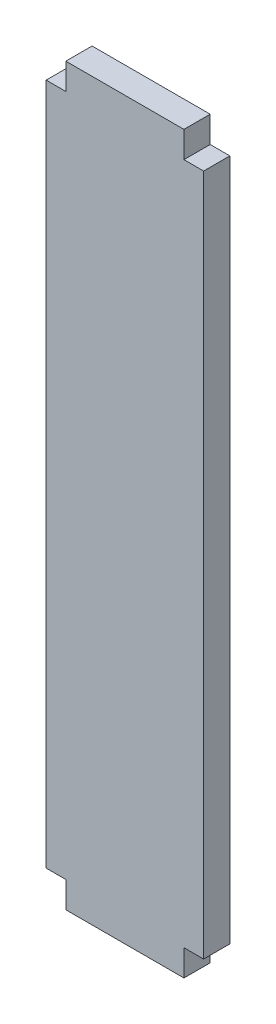
ISO-10303-21;
HEADER;
FILE_DESCRIPTION(('STEP AP214'),'2;1');
FILE_NAME('part.step','',(''),(''),'','','');
FILE_SCHEMA(('AUTOMOTIVE_DESIGN { 1 0 10303 214 1 1 1 1 }'));
ENDSEC;
DATA;
#1=APPLICATION_CONTEXT('core data for automotive mechanical design processes');
#2=APPLICATION_PROTOCOL_DEFINITION('international standard','automotive_design',2000,#1);
#3=PRODUCT_CONTEXT('',#1,'mechanical');
#4=PRODUCT('Part','Part','',(#3));
#5=PRODUCT_RELATED_PRODUCT_CATEGORY('part','',(#4));
#6=PRODUCT_DEFINITION_FORMATION('','',#4);
#7=PRODUCT_DEFINITION_CONTEXT('part definition',#1,'design');
#8=PRODUCT_DEFINITION('design','',#6,#7);
#9=PRODUCT_DEFINITION_SHAPE('','',#8);
#10=(LENGTH_UNIT() NAMED_UNIT(*) SI_UNIT(.MILLI.,.METRE.));
#11=(NAMED_UNIT(*) PLANE_ANGLE_UNIT() SI_UNIT($,.RADIAN.));
#12=(NAMED_UNIT(*) SI_UNIT($,.STERADIAN.) SOLID_ANGLE_UNIT());
#13=UNCERTAINTY_MEASURE_WITH_UNIT(LENGTH_MEASURE(1.E-05),#10,'distance_accuracy_value','');
#14=(GEOMETRIC_REPRESENTATION_CONTEXT(3) GLOBAL_UNCERTAINTY_ASSIGNED_CONTEXT((#13)) GLOBAL_UNIT_ASSIGNED_CONTEXT((#10,
#11,#12)) REPRESENTATION_CONTEXT('',''));
#15=CARTESIAN_POINT('',(0.,0.,0.));
#16=DIRECTION('',(0.,0.,1.));
#17=DIRECTION('',(1.,0.,0.));
#18=AXIS2_PLACEMENT_3D('',#15,#16,#17);
#19=CARTESIAN_POINT('',(2314.88035429651,1090.41049494972,2.));
#20=DIRECTION('',(0.,-1.,0.));
#21=DIRECTION('',(0.,0.,-1.));
#22=AXIS2_PLACEMENT_3D('',#19,#20,#21);
#23=PLANE('',#22);
#24=DIRECTION('',(-1.,0.,0.));
#25=VECTOR('',#24,1.);
#26=CARTESIAN_POINT('',(2314.88035429651,1090.41049494972,0.));
#27=LINE('',#26,#25);
#28=CARTESIAN_POINT('',(2323.88035429651,1090.41049494972,0.));
#29=VERTEX_POINT('',#28);
#30=CARTESIAN_POINT('',(2314.88035429651,1090.41049494972,0.));
#31=VERTEX_POINT('',#30);
#32=EDGE_CURVE('E155',#29,#31,#27,.T.);
#33=ORIENTED_EDGE('',*,*,#32,.T.);
#34=DIRECTION('',(0.,0.,-1.));
#35=VECTOR('',#34,1.);
#36=CARTESIAN_POINT('',(2314.88035429651,1090.41049494972,2.));
#37=LINE('',#36,#35);
#38=CARTESIAN_POINT('',(2314.88035429651,1090.41049494972,2.));
#39=VERTEX_POINT('',#38);
#40=EDGE_CURVE('E11',#39,#31,#37,.T.);
#41=ORIENTED_EDGE('',*,*,#40,.F.);
#42=DIRECTION('',(-1.,0.,0.));
#43=VECTOR('',#42,1.);
#44=CARTESIAN_POINT('',(2314.88035429651,1090.41049494972,2.));
#45=LINE('',#44,#43);
#46=CARTESIAN_POINT('',(2323.88035429651,1090.41049494972,2.));
#47=VERTEX_POINT('',#46);
#48=EDGE_CURVE('E177',#47,#39,#45,.T.);
#49=ORIENTED_EDGE('',*,*,#48,.F.);
#50=DIRECTION('',(0.,0.,-1.));
#51=VECTOR('',#50,1.);
#52=CARTESIAN_POINT('',(2323.88035429651,1090.41049494972,2.));
#53=LINE('',#52,#51);
#54=EDGE_CURVE('E151',#47,#29,#53,.T.);
#55=ORIENTED_EDGE('',*,*,#54,.T.);
#56=EDGE_LOOP('',(#33,#41,#49,#55));
#57=FACE_BOUND('',#56,.T.);
#58=ADVANCED_FACE('F35',(#57),#23,.F.);
#59=CARTESIAN_POINT('',(2314.88035429651,1090.41049494972,2.));
#60=DIRECTION('',(1.,0.,0.));
#61=DIRECTION('',(0.,0.,-1.));
#62=AXIS2_PLACEMENT_3D('',#59,#60,#61);
#63=PLANE('',#62);
#64=DIRECTION('',(0.,-1.,0.));
#65=VECTOR('',#64,1.);
#66=CARTESIAN_POINT('',(2314.88035429651,1090.41049494972,0.));
#67=LINE('',#66,#65);
#68=CARTESIAN_POINT('',(2314.88035429651,1088.41049494972,0.));
#69=VERTEX_POINT('',#68);
#70=EDGE_CURVE('E158',#31,#69,#67,.T.);
#71=ORIENTED_EDGE('',*,*,#70,.T.);
#72=DIRECTION('',(0.,0.,-1.));
#73=VECTOR('',#72,1.);
#74=CARTESIAN_POINT('',(2314.88035429651,1088.41049494972,2.));
#75=LINE('',#74,#73);
#76=CARTESIAN_POINT('',(2314.88035429651,1088.41049494972,2.));
#77=VERTEX_POINT('',#76);
#78=EDGE_CURVE('E43',#77,#69,#75,.T.);
#79=ORIENTED_EDGE('',*,*,#78,.F.);
#80=DIRECTION('',(0.,-1.,0.));
#81=VECTOR('',#80,1.);
#82=CARTESIAN_POINT('',(2314.88035429651,1090.41049494972,2.));
#83=LINE('',#82,#81);
#84=EDGE_CURVE('E106',#39,#77,#83,.T.);
#85=ORIENTED_EDGE('',*,*,#84,.F.);
#86=ORIENTED_EDGE('',*,*,#40,.T.);
#87=EDGE_LOOP('',(#71,#79,#85,#86));
#88=FACE_BOUND('',#87,.T.);
#89=ADVANCED_FACE('F255',(#88),#63,.F.);
#90=CARTESIAN_POINT('',(2314.88035429651,1088.41049494972,2.));
#91=DIRECTION('',(0.,-1.,0.));
#92=DIRECTION('',(0.,0.,-1.));
#93=AXIS2_PLACEMENT_3D('',#90,#91,#92);
#94=PLANE('',#93);
#95=DIRECTION('',(-1.,0.,0.));
#96=VECTOR('',#95,1.);
#97=CARTESIAN_POINT('',(2314.88035429651,1088.41049494972,0.));
#98=LINE('',#97,#96);
#99=CARTESIAN_POINT('',(2313.38035429651,1088.41049494972,0.));
#100=VERTEX_POINT('',#99);
#101=EDGE_CURVE('E160',#69,#100,#98,.T.);
#102=ORIENTED_EDGE('',*,*,#101,.T.);
#103=DIRECTION('',(0.,0.,-1.));
#104=VECTOR('',#103,1.);
#105=CARTESIAN_POINT('',(2313.38035429651,1088.41049494972,2.));
#106=LINE('',#105,#104);
#107=CARTESIAN_POINT('',(2313.38035429651,1088.41049494972,2.));
#108=VERTEX_POINT('',#107);
#109=EDGE_CURVE('E196',#108,#100,#106,.T.);
#110=ORIENTED_EDGE('',*,*,#109,.F.);
#111=DIRECTION('',(-1.,0.,0.));
#112=VECTOR('',#111,1.);
#113=CARTESIAN_POINT('',(2314.88035429651,1088.41049494972,2.));
#114=LINE('',#113,#112);
#115=EDGE_CURVE('E204',#77,#108,#114,.T.);
#116=ORIENTED_EDGE('',*,*,#115,.F.);
#117=ORIENTED_EDGE('',*,*,#78,.T.);
#118=EDGE_LOOP('',(#102,#110,#116,#117));
#119=FACE_BOUND('',#118,.T.);
#120=ADVANCED_FACE('F202',(#119),#94,.F.);
#121=CARTESIAN_POINT('',(2313.38035429651,1036.41049494972,2.));
#122=DIRECTION('',(1.,0.,0.));
#123=DIRECTION('',(0.,0.,-1.));
#124=AXIS2_PLACEMENT_3D('',#121,#122,#123);
#125=PLANE('',#124);
#126=DIRECTION('',(0.,-1.,0.));
#127=VECTOR('',#126,1.);
#128=CARTESIAN_POINT('',(2313.38035429651,1036.41049494972,0.));
#129=LINE('',#128,#127);
#130=CARTESIAN_POINT('',(2313.38035429651,1036.41049494972,0.));
#131=VERTEX_POINT('',#130);
#132=EDGE_CURVE('E162',#100,#131,#129,.T.);
#133=ORIENTED_EDGE('',*,*,#132,.T.);
#134=DIRECTION('',(0.,0.,-1.));
#135=VECTOR('',#134,1.);
#136=CARTESIAN_POINT('',(2313.38035429651,1036.41049494972,2.));
#137=LINE('',#136,#135);
#138=CARTESIAN_POINT('',(2313.38035429651,1036.41049494972,2.));
#139=VERTEX_POINT('',#138);
#140=EDGE_CURVE('E193',#139,#131,#137,.T.);
#141=ORIENTED_EDGE('',*,*,#140,.F.);
#142=DIRECTION('',(0.,-1.,0.));
#143=VECTOR('',#142,1.);
#144=CARTESIAN_POINT('',(2313.38035429651,1036.41049494972,2.));
#145=LINE('',#144,#143);
#146=EDGE_CURVE('E222',#108,#139,#145,.T.);
#147=ORIENTED_EDGE('',*,*,#146,.F.);
#148=ORIENTED_EDGE('',*,*,#109,.T.);
#149=EDGE_LOOP('',(#133,#141,#147,#148));
#150=FACE_BOUND('',#149,.T.);
#151=ADVANCED_FACE('F213',(#150),#125,.F.);
#152=CARTESIAN_POINT('',(2314.88035429651,1036.41049494972,2.));
#153=DIRECTION('',(0.,1.,0.));
#154=DIRECTION('',(0.,0.,1.));
#155=AXIS2_PLACEMENT_3D('',#152,#153,#154);
#156=PLANE('',#155);
#157=DIRECTION('',(1.,0.,0.));
#158=VECTOR('',#157,1.);
#159=CARTESIAN_POINT('',(2314.88035429651,1036.41049494972,0.));
#160=LINE('',#159,#158);
#161=CARTESIAN_POINT('',(2314.88035429651,1036.41049494972,0.));
#162=VERTEX_POINT('',#161);
#163=EDGE_CURVE('E164',#131,#162,#160,.T.);
#164=ORIENTED_EDGE('',*,*,#163,.T.);
#165=DIRECTION('',(0.,0.,-1.));
#166=VECTOR('',#165,1.);
#167=CARTESIAN_POINT('',(2314.88035429651,1036.41049494972,2.));
#168=LINE('',#167,#166);
#169=CARTESIAN_POINT('',(2314.88035429651,1036.41049494972,2.));
#170=VERTEX_POINT('',#169);
#171=EDGE_CURVE('E190',#170,#162,#168,.T.);
#172=ORIENTED_EDGE('',*,*,#171,.F.);
#173=DIRECTION('',(1.,0.,0.));
#174=VECTOR('',#173,1.);
#175=CARTESIAN_POINT('',(2314.88035429651,1036.41049494972,2.));
#176=LINE('',#175,#174);
#177=EDGE_CURVE('E219',#139,#170,#176,.T.);
#178=ORIENTED_EDGE('',*,*,#177,.F.);
#179=ORIENTED_EDGE('',*,*,#140,.T.);
#180=EDGE_LOOP('',(#164,#172,#178,#179));
#181=FACE_BOUND('',#180,.T.);
#182=ADVANCED_FACE('F217',(#181),#156,.F.);
#183=CARTESIAN_POINT('',(2314.88035429651,1034.41049494972,2.));
#184=DIRECTION('',(1.,0.,0.));
#185=DIRECTION('',(0.,0.,-1.));
#186=AXIS2_PLACEMENT_3D('',#183,#184,#185);
#187=PLANE('',#186);
#188=DIRECTION('',(0.,-1.,0.));
#189=VECTOR('',#188,1.);
#190=CARTESIAN_POINT('',(2314.88035429651,1034.41049494972,0.));
#191=LINE('',#190,#189);
#192=CARTESIAN_POINT('',(2314.88035429651,1034.41049494972,0.));
#193=VERTEX_POINT('',#192);
#194=EDGE_CURVE('E166',#162,#193,#191,.T.);
#195=ORIENTED_EDGE('',*,*,#194,.T.);
#196=DIRECTION('',(0.,0.,-1.));
#197=VECTOR('',#196,1.);
#198=CARTESIAN_POINT('',(2314.88035429651,1034.41049494972,2.));
#199=LINE('',#198,#197);
#200=CARTESIAN_POINT('',(2314.88035429651,1034.41049494972,2.));
#201=VERTEX_POINT('',#200);
#202=EDGE_CURVE('E187',#201,#193,#199,.T.);
#203=ORIENTED_EDGE('',*,*,#202,.F.);
#204=DIRECTION('',(0.,-1.,0.));
#205=VECTOR('',#204,1.);
#206=CARTESIAN_POINT('',(2314.88035429651,1034.41049494972,2.));
#207=LINE('',#206,#205);
#208=EDGE_CURVE('E221',#170,#201,#207,.T.);
#209=ORIENTED_EDGE('',*,*,#208,.F.);
#210=ORIENTED_EDGE('',*,*,#171,.T.);
#211=EDGE_LOOP('',(#195,#203,#209,#210));
#212=FACE_BOUND('',#211,.T.);
#213=ADVANCED_FACE('F268',(#212),#187,.F.);
#214=CARTESIAN_POINT('',(2314.88035429651,1034.41049494972,2.));
#215=DIRECTION('',(0.,1.,0.));
#216=DIRECTION('',(0.,0.,1.));
#217=AXIS2_PLACEMENT_3D('',#214,#215,#216);
#218=PLANE('',#217);
#219=DIRECTION('',(1.,0.,0.));
#220=VECTOR('',#219,1.);
#221=CARTESIAN_POINT('',(2314.88035429651,1034.41049494972,0.));
#222=LINE('',#221,#220);
#223=CARTESIAN_POINT('',(2323.88035429651,1034.41049494972,0.));
#224=VERTEX_POINT('',#223);
#225=EDGE_CURVE('E168',#193,#224,#222,.T.);
#226=ORIENTED_EDGE('',*,*,#225,.T.);
#227=DIRECTION('',(0.,0.,-1.));
#228=VECTOR('',#227,1.);
#229=CARTESIAN_POINT('',(2323.88035429651,1034.41049494972,2.));
#230=LINE('',#229,#228);
#231=CARTESIAN_POINT('',(2323.88035429651,1034.41049494972,2.));
#232=VERTEX_POINT('',#231);
#233=EDGE_CURVE('E184',#232,#224,#230,.T.);
#234=ORIENTED_EDGE('',*,*,#233,.F.);
#235=DIRECTION('',(1.,0.,0.));
#236=VECTOR('',#235,1.);
#237=CARTESIAN_POINT('',(2314.88035429651,1034.41049494972,2.));
#238=LINE('',#237,#236);
#239=EDGE_CURVE('E224',#201,#232,#238,.T.);
#240=ORIENTED_EDGE('',*,*,#239,.F.);
#241=ORIENTED_EDGE('',*,*,#202,.T.);
#242=EDGE_LOOP('',(#226,#234,#240,#241));
#243=FACE_BOUND('',#242,.T.);
#244=ADVANCED_FACE('F271',(#243),#218,.F.);
#245=CARTESIAN_POINT('',(2323.88035429651,1034.41049494972,2.));
#246=DIRECTION('',(-1.,0.,0.));
#247=DIRECTION('',(0.,0.,1.));
#248=AXIS2_PLACEMENT_3D('',#245,#246,#247);
#249=PLANE('',#248);
#250=DIRECTION('',(0.,1.,0.));
#251=VECTOR('',#250,1.);
#252=CARTESIAN_POINT('',(2323.88035429651,1034.41049494972,0.));
#253=LINE('',#252,#251);
#254=CARTESIAN_POINT('',(2323.88035429651,1036.41049494972,0.));
#255=VERTEX_POINT('',#254);
#256=EDGE_CURVE('E170',#224,#255,#253,.T.);
#257=ORIENTED_EDGE('',*,*,#256,.T.);
#258=DIRECTION('',(0.,0.,-1.));
#259=VECTOR('',#258,1.);
#260=CARTESIAN_POINT('',(2323.88035429651,1036.41049494972,2.));
#261=LINE('',#260,#259);
#262=CARTESIAN_POINT('',(2323.88035429651,1036.41049494972,2.));
#263=VERTEX_POINT('',#262);
#264=EDGE_CURVE('E181',#263,#255,#261,.T.);
#265=ORIENTED_EDGE('',*,*,#264,.F.);
#266=DIRECTION('',(0.,1.,0.));
#267=VECTOR('',#266,1.);
#268=CARTESIAN_POINT('',(2323.88035429651,1034.41049494972,2.));
#269=LINE('',#268,#267);
#270=EDGE_CURVE('E230',#232,#263,#269,.T.);
#271=ORIENTED_EDGE('',*,*,#270,.F.);
#272=ORIENTED_EDGE('',*,*,#233,.T.);
#273=EDGE_LOOP('',(#257,#265,#271,#272));
#274=FACE_BOUND('',#273,.T.);
#275=ADVANCED_FACE('F236',(#274),#249,.F.);
#276=CARTESIAN_POINT('',(2323.88035429651,1036.41049494972,2.));
#277=DIRECTION('',(0.,1.,0.));
#278=DIRECTION('',(0.,0.,1.));
#279=AXIS2_PLACEMENT_3D('',#276,#277,#278);
#280=PLANE('',#279);
#281=DIRECTION('',(1.,0.,0.));
#282=VECTOR('',#281,1.);
#283=CARTESIAN_POINT('',(2323.88035429651,1036.41049494972,0.));
#284=LINE('',#283,#282);
#285=CARTESIAN_POINT('',(2325.38035429651,1036.41049494972,0.));
#286=VERTEX_POINT('',#285);
#287=EDGE_CURVE('E172',#255,#286,#284,.T.);
#288=ORIENTED_EDGE('',*,*,#287,.T.);
#289=DIRECTION('',(0.,0.,-1.));
#290=VECTOR('',#289,1.);
#291=CARTESIAN_POINT('',(2325.38035429651,1036.41049494972,2.));
#292=LINE('',#291,#290);
#293=CARTESIAN_POINT('',(2325.38035429651,1036.41049494972,2.));
#294=VERTEX_POINT('',#293);
#295=EDGE_CURVE('E146',#294,#286,#292,.T.);
#296=ORIENTED_EDGE('',*,*,#295,.F.);
#297=DIRECTION('',(1.,0.,0.));
#298=VECTOR('',#297,1.);
#299=CARTESIAN_POINT('',(2323.88035429651,1036.41049494972,2.));
#300=LINE('',#299,#298);
#301=EDGE_CURVE('E137',#263,#294,#300,.T.);
#302=ORIENTED_EDGE('',*,*,#301,.F.);
#303=ORIENTED_EDGE('',*,*,#264,.T.);
#304=EDGE_LOOP('',(#288,#296,#302,#303));
#305=FACE_BOUND('',#304,.T.);
#306=ADVANCED_FACE('F240',(#305),#280,.F.);
#307=CARTESIAN_POINT('',(2325.38035429651,1088.41049494972,2.));
#308=DIRECTION('',(-1.,0.,0.));
#309=DIRECTION('',(0.,0.,1.));
#310=AXIS2_PLACEMENT_3D('',#307,#308,#309);
#311=PLANE('',#310);
#312=DIRECTION('',(0.,1.,0.));
#313=VECTOR('',#312,1.);
#314=CARTESIAN_POINT('',(2325.38035429651,1088.41049494972,0.));
#315=LINE('',#314,#313);
#316=CARTESIAN_POINT('',(2325.38035429651,1088.41049494972,0.));
#317=VERTEX_POINT('',#316);
#318=EDGE_CURVE('E145',#286,#317,#315,.T.);
#319=ORIENTED_EDGE('',*,*,#318,.T.);
#320=DIRECTION('',(0.,0.,-1.));
#321=VECTOR('',#320,1.);
#322=CARTESIAN_POINT('',(2325.38035429651,1088.41049494972,2.));
#323=LINE('',#322,#321);
#324=CARTESIAN_POINT('',(2325.38035429651,1088.41049494972,2.));
#325=VERTEX_POINT('',#324);
#326=EDGE_CURVE('E142',#325,#317,#323,.T.);
#327=ORIENTED_EDGE('',*,*,#326,.F.);
#328=DIRECTION('',(0.,1.,0.));
#329=VECTOR('',#328,1.);
#330=CARTESIAN_POINT('',(2325.38035429651,1088.41049494972,2.));
#331=LINE('',#330,#329);
#332=EDGE_CURVE('E131',#294,#325,#331,.T.);
#333=ORIENTED_EDGE('',*,*,#332,.F.);
#334=ORIENTED_EDGE('',*,*,#295,.T.);
#335=EDGE_LOOP('',(#319,#327,#333,#334));
#336=FACE_BOUND('',#335,.T.);
#337=ADVANCED_FACE('F143',(#336),#311,.F.);
#338=CARTESIAN_POINT('',(2323.88035429651,1088.41049494972,2.));
#339=DIRECTION('',(0.,-1.,0.));
#340=DIRECTION('',(0.,0.,-1.));
#341=AXIS2_PLACEMENT_3D('',#338,#339,#340);
#342=PLANE('',#341);
#343=DIRECTION('',(-1.,0.,0.));
#344=VECTOR('',#343,1.);
#345=CARTESIAN_POINT('',(2323.88035429651,1088.41049494972,0.));
#346=LINE('',#345,#344);
#347=CARTESIAN_POINT('',(2323.88035429651,1088.41049494972,0.));
#348=VERTEX_POINT('',#347);
#349=EDGE_CURVE('E92',#317,#348,#346,.T.);
#350=ORIENTED_EDGE('',*,*,#349,.T.);
#351=DIRECTION('',(0.,0.,-1.));
#352=VECTOR('',#351,1.);
#353=CARTESIAN_POINT('',(2323.88035429651,1088.41049494972,2.));
#354=LINE('',#353,#352);
#355=CARTESIAN_POINT('',(2323.88035429651,1088.41049494972,2.));
#356=VERTEX_POINT('',#355);
#357=EDGE_CURVE('E147',#356,#348,#354,.T.);
#358=ORIENTED_EDGE('',*,*,#357,.F.);
#359=DIRECTION('',(-1.,0.,0.));
#360=VECTOR('',#359,1.);
#361=CARTESIAN_POINT('',(2323.88035429651,1088.41049494972,2.));
#362=LINE('',#361,#360);
#363=EDGE_CURVE('E135',#325,#356,#362,.T.);
#364=ORIENTED_EDGE('',*,*,#363,.F.);
#365=ORIENTED_EDGE('',*,*,#326,.T.);
#366=EDGE_LOOP('',(#350,#358,#364,#365));
#367=FACE_BOUND('',#366,.T.);
#368=ADVANCED_FACE('F149',(#367),#342,.F.);
#369=CARTESIAN_POINT('',(2323.88035429651,1090.41049494972,2.));
#370=DIRECTION('',(-1.,0.,0.));
#371=DIRECTION('',(0.,0.,1.));
#372=AXIS2_PLACEMENT_3D('',#369,#370,#371);
#373=PLANE('',#372);
#374=DIRECTION('',(0.,1.,0.));
#375=VECTOR('',#374,1.);
#376=CARTESIAN_POINT('',(2323.88035429651,1090.41049494972,0.));
#377=LINE('',#376,#375);
#378=EDGE_CURVE('E98',#348,#29,#377,.T.);
#379=ORIENTED_EDGE('',*,*,#378,.T.);
#380=ORIENTED_EDGE('',*,*,#54,.F.);
#381=DIRECTION('',(0.,1.,0.));
#382=VECTOR('',#381,1.);
#383=CARTESIAN_POINT('',(2323.88035429651,1090.41049494972,2.));
#384=LINE('',#383,#382);
#385=EDGE_CURVE('E51',#356,#47,#384,.T.);
#386=ORIENTED_EDGE('',*,*,#385,.F.);
#387=ORIENTED_EDGE('',*,*,#357,.T.);
#388=EDGE_LOOP('',(#379,#380,#386,#387));
#389=FACE_BOUND('',#388,.T.);
#390=ADVANCED_FACE('F244',(#389),#373,.F.);
#391=CARTESIAN_POINT('',(0.,0.,2.));
#392=DIRECTION('',(0.,0.,-1.));
#393=DIRECTION('',(-1.,0.,0.));
#394=AXIS2_PLACEMENT_3D('',#391,#392,#393);
#395=PLANE('',#394);
#396=ORIENTED_EDGE('',*,*,#48,.T.);
#397=ORIENTED_EDGE('',*,*,#84,.T.);
#398=ORIENTED_EDGE('',*,*,#115,.T.);
#399=ORIENTED_EDGE('',*,*,#146,.T.);
#400=ORIENTED_EDGE('',*,*,#177,.T.);
#401=ORIENTED_EDGE('',*,*,#208,.T.);
#402=ORIENTED_EDGE('',*,*,#239,.T.);
#403=ORIENTED_EDGE('',*,*,#270,.T.);
#404=ORIENTED_EDGE('',*,*,#301,.T.);
#405=ORIENTED_EDGE('',*,*,#332,.T.);
#406=ORIENTED_EDGE('',*,*,#363,.T.);
#407=ORIENTED_EDGE('',*,*,#385,.T.);
#408=EDGE_LOOP('',(#396,#397,#398,#399,#400,#401,#402,#403,#404,#405,#406,#407));
#409=FACE_BOUND('',#408,.T.);
#410=ADVANCED_FACE('F133',(#409),#395,.F.);
#411=CARTESIAN_POINT('',(0.,0.,0.));
#412=DIRECTION('',(0.,0.,-1.));
#413=DIRECTION('',(-1.,0.,0.));
#414=AXIS2_PLACEMENT_3D('',#411,#412,#413);
#415=PLANE('',#414);
#416=ORIENTED_EDGE('',*,*,#32,.F.);
#417=ORIENTED_EDGE('',*,*,#378,.F.);
#418=ORIENTED_EDGE('',*,*,#349,.F.);
#419=ORIENTED_EDGE('',*,*,#318,.F.);
#420=ORIENTED_EDGE('',*,*,#287,.F.);
#421=ORIENTED_EDGE('',*,*,#256,.F.);
#422=ORIENTED_EDGE('',*,*,#225,.F.);
#423=ORIENTED_EDGE('',*,*,#194,.F.);
#424=ORIENTED_EDGE('',*,*,#163,.F.);
#425=ORIENTED_EDGE('',*,*,#132,.F.);
#426=ORIENTED_EDGE('',*,*,#101,.F.);
#427=ORIENTED_EDGE('',*,*,#70,.F.);
#428=EDGE_LOOP('',(#416,#417,#418,#419,#420,#421,#422,#423,#424,#425,#426,#427));
#429=FACE_BOUND('',#428,.T.);
#430=ADVANCED_FACE('F208',(#429),#415,.T.);
#431=CLOSED_SHELL('',(#58,#89,#120,#151,#182,#213,#244,#275,#306,#337,#368,#390,#410,#430));
#432=MANIFOLD_SOLID_BREP('B2',#431);
#433=ADVANCED_BREP_SHAPE_REPRESENTATION('',(#18,#432),#14);
#434=SHAPE_DEFINITION_REPRESENTATION(#9,#433);
ENDSEC;
END-ISO-10303-21;
